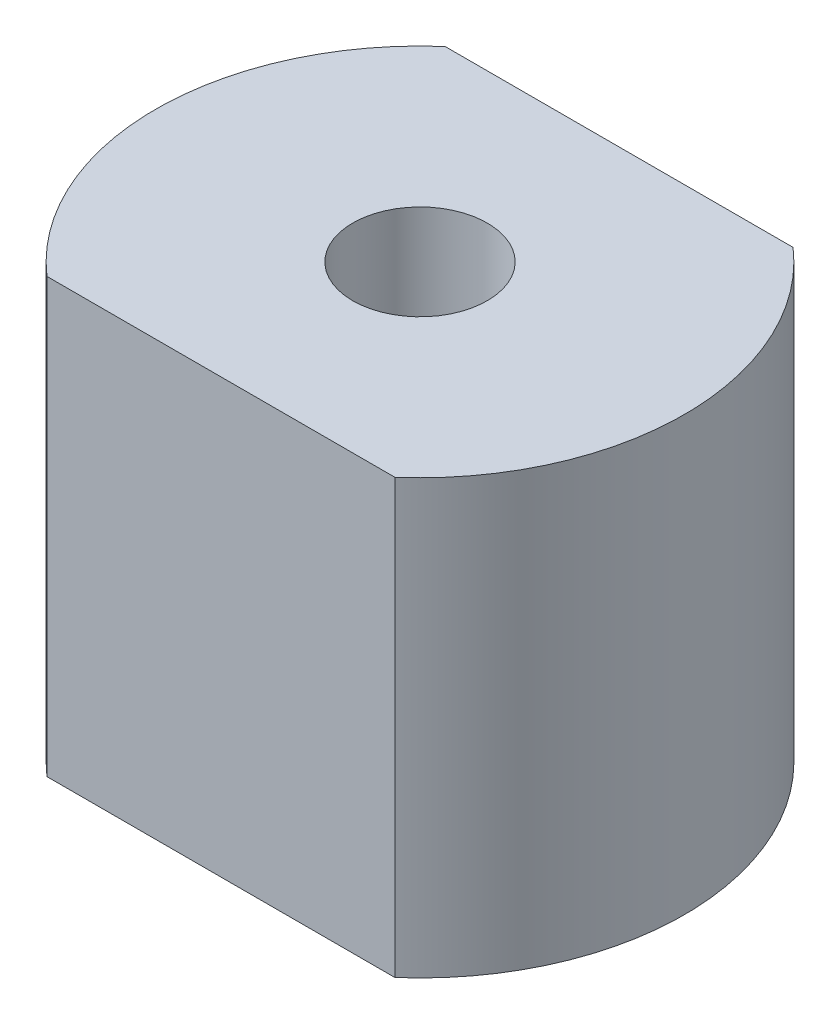
ISO-10303-21;
HEADER;
FILE_DESCRIPTION(('STEP AP214'),'2;1');
FILE_NAME('part.step','',(''),(''),'','','');
FILE_SCHEMA(('AUTOMOTIVE_DESIGN { 1 0 10303 214 1 1 1 1 }'));
ENDSEC;
DATA;
#1=APPLICATION_CONTEXT('core data for automotive mechanical design processes');
#2=APPLICATION_PROTOCOL_DEFINITION('international standard','automotive_design',2000,#1);
#3=PRODUCT_CONTEXT('',#1,'mechanical');
#4=PRODUCT('Part','Part','',(#3));
#5=PRODUCT_RELATED_PRODUCT_CATEGORY('part','',(#4));
#6=PRODUCT_DEFINITION_FORMATION('','',#4);
#7=PRODUCT_DEFINITION_CONTEXT('part definition',#1,'design');
#8=PRODUCT_DEFINITION('design','',#6,#7);
#9=PRODUCT_DEFINITION_SHAPE('','',#8);
#10=(LENGTH_UNIT() NAMED_UNIT(*) SI_UNIT(.MILLI.,.METRE.));
#11=(NAMED_UNIT(*) PLANE_ANGLE_UNIT() SI_UNIT($,.RADIAN.));
#12=(NAMED_UNIT(*) SI_UNIT($,.STERADIAN.) SOLID_ANGLE_UNIT());
#13=UNCERTAINTY_MEASURE_WITH_UNIT(LENGTH_MEASURE(1.E-05),#10,'distance_accuracy_value','');
#14=(GEOMETRIC_REPRESENTATION_CONTEXT(3) GLOBAL_UNCERTAINTY_ASSIGNED_CONTEXT((#13)) GLOBAL_UNIT_ASSIGNED_CONTEXT((#10,
#11,#12)) REPRESENTATION_CONTEXT('',''));
#15=CARTESIAN_POINT('',(0.,0.,0.));
#16=DIRECTION('',(0.,0.,1.));
#17=DIRECTION('',(1.,0.,0.));
#18=AXIS2_PLACEMENT_3D('',#15,#16,#17);
#19=CARTESIAN_POINT('',(2.57570117955439,0.,8.09122870249017));
#20=DIRECTION('',(0.,-1.,0.));
#21=DIRECTION('',(0.,0.,-1.));
#22=AXIS2_PLACEMENT_3D('',#19,#20,#21);
#23=CYLINDRICAL_SURFACE('',#22,5.207);
#24=CARTESIAN_POINT('',(2.57570117955439,8.128,8.09122870249017));
#25=DIRECTION('',(0.,-1.,0.));
#26=DIRECTION('',(0.,0.,-1.));
#27=AXIS2_PLACEMENT_3D('',#24,#25,#26);
#28=CIRCLE('',#27,5.207);
#29=CARTESIAN_POINT('',(2.57570117955439,8.128,2.88422870249017));
#30=VERTEX_POINT('',#29);
#31=EDGE_CURVE('E112',#30,#30,#28,.F.);
#32=ORIENTED_EDGE('',*,*,#31,.T.);
#33=EDGE_LOOP('',(#32));
#34=FACE_BOUND('',#33,.T.);
#35=CARTESIAN_POINT('',(2.57570117955439,4.064,8.09122870249017));
#36=DIRECTION('',(0.,-1.,0.));
#37=DIRECTION('',(0.,0.,-1.));
#38=AXIS2_PLACEMENT_3D('',#35,#36,#37);
#39=CIRCLE('',#38,5.207);
#40=CARTESIAN_POINT('',(2.57570117955439,4.064,2.88422870249017));
#41=VERTEX_POINT('',#40);
#42=EDGE_CURVE('E19',#41,#41,#39,.T.);
#43=ORIENTED_EDGE('',*,*,#42,.T.);
#44=EDGE_LOOP('',(#43));
#45=FACE_BOUND('',#44,.T.);
#46=ADVANCED_FACE('F16',(#34,#45),#23,.F.);
#47=CARTESIAN_POINT('',(10.7037011795544,12.7,8.09122870249017));
#48=DIRECTION('',(0.,1.,0.));
#49=DIRECTION('',(0.,0.,1.));
#50=AXIS2_PLACEMENT_3D('',#47,#48,#49);
#51=PLANE('',#50);
#52=CARTESIAN_POINT('',(10.7037011795544,12.7,8.09122870249017));
#53=DIRECTION('',(0.,-1.,0.));
#54=DIRECTION('',(0.,0.,-1.));
#55=AXIS2_PLACEMENT_3D('',#52,#53,#54);
#56=CIRCLE('',#55,1.07823);
#57=CARTESIAN_POINT('',(10.7037011795544,12.7,7.01299870249017));
#58=VERTEX_POINT('',#57);
#59=EDGE_CURVE('E110',#58,#58,#56,.T.);
#60=ORIENTED_EDGE('',*,*,#59,.T.);
#61=EDGE_LOOP('',(#60));
#62=FACE_BOUND('',#61,.T.);
#63=ADVANCED_FACE('F247',(#62),#51,.F.);
#64=CARTESIAN_POINT('',(-5.55229882044561,12.7,8.09122870249017));
#65=DIRECTION('',(0.,1.,0.));
#66=DIRECTION('',(0.,0.,1.));
#67=AXIS2_PLACEMENT_3D('',#64,#65,#66);
#68=PLANE('',#67);
#69=CARTESIAN_POINT('',(-5.55229882044561,12.7,8.09122870249017));
#70=DIRECTION('',(0.,-1.,0.));
#71=DIRECTION('',(0.,0.,-1.));
#72=AXIS2_PLACEMENT_3D('',#69,#70,#71);
#73=CIRCLE('',#72,1.07823);
#74=CARTESIAN_POINT('',(-5.55229882044561,12.7,7.01299870249017));
#75=VERTEX_POINT('',#74);
#76=EDGE_CURVE('E107',#75,#75,#73,.T.);
#77=ORIENTED_EDGE('',*,*,#76,.T.);
#78=EDGE_LOOP('',(#77));
#79=FACE_BOUND('',#78,.T.);
#80=ADVANCED_FACE('F124',(#79),#68,.F.);
#81=CARTESIAN_POINT('',(2.57570117955439,4.064,8.09122870249017));
#82=DIRECTION('',(0.,1.,0.));
#83=DIRECTION('',(0.,0.,1.));
#84=AXIS2_PLACEMENT_3D('',#81,#82,#83);
#85=PLANE('',#84);
#86=ORIENTED_EDGE('',*,*,#42,.F.);
#87=EDGE_LOOP('',(#86));
#88=FACE_BOUND('',#87,.T.);
#89=CARTESIAN_POINT('',(2.57570117955439,4.064,8.09122870249017));
#90=DIRECTION('',(0.,1.,0.));
#91=DIRECTION('',(0.,0.,1.));
#92=AXIS2_PLACEMENT_3D('',#89,#90,#91);
#93=CIRCLE('',#92,6.3754);
#94=CARTESIAN_POINT('',(2.57570117955439,4.064,14.4666287024902));
#95=VERTEX_POINT('',#94);
#96=EDGE_CURVE('E104',#95,#95,#93,.F.);
#97=ORIENTED_EDGE('',*,*,#96,.T.);
#98=EDGE_LOOP('',(#97));
#99=FACE_BOUND('',#98,.T.);
#100=ADVANCED_FACE('F120',(#88,#99),#85,.F.);
#101=CARTESIAN_POINT('',(2.57570117955439,8.128,8.09122870249017));
#102=DIRECTION('',(0.,1.,0.));
#103=DIRECTION('',(0.,0.,1.));
#104=AXIS2_PLACEMENT_3D('',#101,#102,#103);
#105=PLANE('',#104);
#106=ORIENTED_EDGE('',*,*,#31,.F.);
#107=EDGE_LOOP('',(#106));
#108=FACE_BOUND('',#107,.T.);
#109=CARTESIAN_POINT('',(2.57570117955439,8.128,8.09122870249017));
#110=DIRECTION('',(0.,1.,0.));
#111=DIRECTION('',(0.,0.,1.));
#112=AXIS2_PLACEMENT_3D('',#109,#110,#111);
#113=CIRCLE('',#112,2.68351);
#114=CARTESIAN_POINT('',(2.57570117955439,8.128,10.7747387024902));
#115=VERTEX_POINT('',#114);
#116=EDGE_CURVE('E74',#115,#115,#113,.T.);
#117=ORIENTED_EDGE('',*,*,#116,.T.);
#118=EDGE_LOOP('',(#117));
#119=FACE_BOUND('',#118,.T.);
#120=ADVANCED_FACE('F123',(#108,#119),#105,.F.);
#121=CARTESIAN_POINT('',(10.7037011795544,0.,8.09122870249017));
#122=DIRECTION('',(0.,-1.,0.));
#123=DIRECTION('',(0.,0.,-1.));
#124=AXIS2_PLACEMENT_3D('',#121,#122,#123);
#125=CYLINDRICAL_SURFACE('',#124,1.07823);
#126=CARTESIAN_POINT('',(10.7037011795544,0.,8.09122870249017));
#127=DIRECTION('',(0.,-1.,0.));
#128=DIRECTION('',(0.,0.,-1.));
#129=AXIS2_PLACEMENT_3D('',#126,#127,#128);
#130=CIRCLE('',#129,1.07823);
#131=CARTESIAN_POINT('',(10.7037011795544,0.,7.01299870249017));
#132=VERTEX_POINT('',#131);
#133=EDGE_CURVE('E73',#132,#132,#130,.T.);
#134=ORIENTED_EDGE('',*,*,#133,.T.);
#135=EDGE_LOOP('',(#134));
#136=FACE_BOUND('',#135,.T.);
#137=ORIENTED_EDGE('',*,*,#59,.F.);
#138=EDGE_LOOP('',(#137));
#139=FACE_BOUND('',#138,.T.);
#140=ADVANCED_FACE('F141',(#136,#139),#125,.F.);
#141=CARTESIAN_POINT('',(-5.55229882044561,0.,8.09122870249017));
#142=DIRECTION('',(0.,-1.,0.));
#143=DIRECTION('',(0.,0.,-1.));
#144=AXIS2_PLACEMENT_3D('',#141,#142,#143);
#145=CYLINDRICAL_SURFACE('',#144,1.07823);
#146=CARTESIAN_POINT('',(-5.55229882044561,0.,8.09122870249017));
#147=DIRECTION('',(0.,-1.,0.));
#148=DIRECTION('',(0.,0.,-1.));
#149=AXIS2_PLACEMENT_3D('',#146,#147,#148);
#150=CIRCLE('',#149,1.07823);
#151=CARTESIAN_POINT('',(-5.55229882044561,0.,7.01299870249017));
#152=VERTEX_POINT('',#151);
#153=EDGE_CURVE('E97',#152,#152,#150,.T.);
#154=ORIENTED_EDGE('',*,*,#153,.T.);
#155=EDGE_LOOP('',(#154));
#156=FACE_BOUND('',#155,.T.);
#157=ORIENTED_EDGE('',*,*,#76,.F.);
#158=EDGE_LOOP('',(#157));
#159=FACE_BOUND('',#158,.T.);
#160=ADVANCED_FACE('F131',(#156,#159),#145,.F.);
#161=CARTESIAN_POINT('',(2.57570117955439,4.064,8.09122870249017));
#162=DIRECTION('',(0.,1.,0.));
#163=DIRECTION('',(0.,0.,1.));
#164=AXIS2_PLACEMENT_3D('',#161,#162,#163);
#165=CYLINDRICAL_SURFACE('',#164,6.3754);
#166=CARTESIAN_POINT('',(2.57570117955439,0.,8.09122870249017));
#167=DIRECTION('',(0.,1.,0.));
#168=DIRECTION('',(0.,0.,1.));
#169=AXIS2_PLACEMENT_3D('',#166,#167,#168);
#170=CIRCLE('',#169,6.3754);
#171=CARTESIAN_POINT('',(2.57570117955439,0.,14.4666287024902));
#172=VERTEX_POINT('',#171);
#173=EDGE_CURVE('E65',#172,#172,#170,.F.);
#174=ORIENTED_EDGE('',*,*,#173,.T.);
#175=EDGE_LOOP('',(#174));
#176=FACE_BOUND('',#175,.T.);
#177=ORIENTED_EDGE('',*,*,#96,.F.);
#178=EDGE_LOOP('',(#177));
#179=FACE_BOUND('',#178,.T.);
#180=ADVANCED_FACE('F128',(#176,#179),#165,.F.);
#181=CARTESIAN_POINT('',(2.57570117955439,39.668265265213,8.09122870249017));
#182=DIRECTION('',(0.,1.,0.));
#183=DIRECTION('',(0.,0.,1.));
#184=AXIS2_PLACEMENT_3D('',#181,#182,#183);
#185=CYLINDRICAL_SURFACE('',#184,2.68351);
#186=CARTESIAN_POINT('',(2.57570117955439,17.272,8.09122870249017));
#187=DIRECTION('',(0.,1.,0.));
#188=DIRECTION('',(0.,0.,1.));
#189=AXIS2_PLACEMENT_3D('',#186,#187,#188);
#190=CIRCLE('',#189,2.68351);
#191=CARTESIAN_POINT('',(2.57570117955439,17.272,10.7747387024902));
#192=VERTEX_POINT('',#191);
#193=EDGE_CURVE('E80',#192,#192,#190,.F.);
#194=ORIENTED_EDGE('',*,*,#193,.F.);
#195=EDGE_LOOP('',(#194));
#196=FACE_BOUND('',#195,.T.);
#197=ORIENTED_EDGE('',*,*,#116,.F.);
#198=EDGE_LOOP('',(#197));
#199=FACE_BOUND('',#198,.T.);
#200=ADVANCED_FACE('F130',(#196,#199),#185,.F.);
#201=CARTESIAN_POINT('',(2.57570117955439,17.272,8.09122870249017));
#202=DIRECTION('',(0.,1.,0.));
#203=DIRECTION('',(0.,0.,1.));
#204=AXIS2_PLACEMENT_3D('',#201,#202,#203);
#205=CYLINDRICAL_SURFACE('',#204,10.541);
#206=CARTESIAN_POINT('',(2.57570117955439,17.272,8.09122870249017));
#207=DIRECTION('',(0.,1.,0.));
#208=DIRECTION('',(0.,0.,1.));
#209=AXIS2_PLACEMENT_3D('',#206,#207,#208);
#210=CIRCLE('',#209,10.541);
#211=CARTESIAN_POINT('',(-4.3603477497713,17.272,0.15372870249017));
#212=VERTEX_POINT('',#211);
#213=CARTESIAN_POINT('',(-4.36034774977128,17.272,16.0287287024902));
#214=VERTEX_POINT('',#213);
#215=EDGE_CURVE('E60',#212,#214,#210,.T.);
#216=ORIENTED_EDGE('',*,*,#215,.F.);
#217=DIRECTION('',(0.,1.,0.));
#218=VECTOR('',#217,1.);
#219=CARTESIAN_POINT('',(-4.3603477497713,17.272,0.153728702490171));
#220=LINE('',#219,#218);
#221=CARTESIAN_POINT('',(-4.3603477497713,0.,0.153728702490171));
#222=VERTEX_POINT('',#221);
#223=EDGE_CURVE('E55',#212,#222,#220,.F.);
#224=ORIENTED_EDGE('',*,*,#223,.T.);
#225=CARTESIAN_POINT('',(2.57570117955439,0.,8.09122870249017));
#226=DIRECTION('',(0.,1.,0.));
#227=DIRECTION('',(0.,0.,1.));
#228=AXIS2_PLACEMENT_3D('',#225,#226,#227);
#229=CIRCLE('',#228,10.541);
#230=CARTESIAN_POINT('',(-4.36034774977128,0.,16.0287287024902));
#231=VERTEX_POINT('',#230);
#232=EDGE_CURVE('E58',#222,#231,#229,.T.);
#233=ORIENTED_EDGE('',*,*,#232,.T.);
#234=DIRECTION('',(0.,1.,0.));
#235=VECTOR('',#234,1.);
#236=CARTESIAN_POINT('',(-4.36034774977129,17.272,16.0287287024902));
#237=LINE('',#236,#235);
#238=EDGE_CURVE('E88',#231,#214,#237,.T.);
#239=ORIENTED_EDGE('',*,*,#238,.T.);
#240=EDGE_LOOP('',(#216,#224,#233,#239));
#241=FACE_BOUND('',#240,.T.);
#242=ADVANCED_FACE('F57',(#241),#205,.T.);
#243=CARTESIAN_POINT('',(2.57570117955439,0.,8.09122870249017));
#244=DIRECTION('',(0.,1.,0.));
#245=DIRECTION('',(0.,0.,1.));
#246=AXIS2_PLACEMENT_3D('',#243,#244,#245);
#247=PLANE('',#246);
#248=ORIENTED_EDGE('',*,*,#173,.F.);
#249=EDGE_LOOP('',(#248));
#250=FACE_BOUND('',#249,.T.);
#251=ORIENTED_EDGE('',*,*,#153,.F.);
#252=EDGE_LOOP('',(#251));
#253=FACE_BOUND('',#252,.T.);
#254=ORIENTED_EDGE('',*,*,#133,.F.);
#255=EDGE_LOOP('',(#254));
#256=FACE_BOUND('',#255,.T.);
#257=DIRECTION('',(1.,0.,0.));
#258=VECTOR('',#257,1.);
#259=CARTESIAN_POINT('',(9.51175010888007,0.,0.153728702490171));
#260=LINE('',#259,#258);
#261=CARTESIAN_POINT('',(9.51175010888007,0.,0.153728702490169));
#262=VERTEX_POINT('',#261);
#263=EDGE_CURVE('E64',#222,#262,#260,.T.);
#264=ORIENTED_EDGE('',*,*,#263,.T.);
#265=CARTESIAN_POINT('',(2.57570117955439,0.,8.09122870249017));
#266=DIRECTION('',(0.,1.,0.));
#267=DIRECTION('',(0.,0.,1.));
#268=AXIS2_PLACEMENT_3D('',#265,#266,#267);
#269=CIRCLE('',#268,10.541);
#270=CARTESIAN_POINT('',(9.51175010888005,0.,16.0287287024902));
#271=VERTEX_POINT('',#270);
#272=EDGE_CURVE('E87',#271,#262,#269,.T.);
#273=ORIENTED_EDGE('',*,*,#272,.F.);
#274=DIRECTION('',(-1.,0.,0.));
#275=VECTOR('',#274,1.);
#276=CARTESIAN_POINT('',(-4.36034774977129,0.,16.0287287024902));
#277=LINE('',#276,#275);
#278=EDGE_CURVE('E71',#271,#231,#277,.T.);
#279=ORIENTED_EDGE('',*,*,#278,.T.);
#280=ORIENTED_EDGE('',*,*,#232,.F.);
#281=EDGE_LOOP('',(#264,#273,#279,#280));
#282=FACE_BOUND('',#281,.T.);
#283=ADVANCED_FACE('F68',(#250,#253,#256,#282),#247,.F.);
#284=CARTESIAN_POINT('',(9.51175010888007,17.272,0.153728702490171));
#285=DIRECTION('',(0.,0.,1.));
#286=DIRECTION('',(1.,0.,0.));
#287=AXIS2_PLACEMENT_3D('',#284,#285,#286);
#288=PLANE('',#287);
#289=ORIENTED_EDGE('',*,*,#223,.F.);
#290=DIRECTION('',(1.,0.,0.));
#291=VECTOR('',#290,1.);
#292=CARTESIAN_POINT('',(2.57570117955439,17.272,0.153728702490169));
#293=LINE('',#292,#291);
#294=CARTESIAN_POINT('',(9.51175010888007,17.272,0.153728702490168));
#295=VERTEX_POINT('',#294);
#296=EDGE_CURVE('E89',#295,#212,#293,.F.);
#297=ORIENTED_EDGE('',*,*,#296,.F.);
#298=DIRECTION('',(0.,1.,0.));
#299=VECTOR('',#298,1.);
#300=CARTESIAN_POINT('',(9.51175010888007,17.272,0.153728702490167));
#301=LINE('',#300,#299);
#302=EDGE_CURVE('E78',#262,#295,#301,.T.);
#303=ORIENTED_EDGE('',*,*,#302,.F.);
#304=ORIENTED_EDGE('',*,*,#263,.F.);
#305=EDGE_LOOP('',(#289,#297,#303,#304));
#306=FACE_BOUND('',#305,.T.);
#307=ADVANCED_FACE('F76',(#306),#288,.F.);
#308=CARTESIAN_POINT('',(2.57570117955439,17.272,8.09122870249017));
#309=DIRECTION('',(0.,1.,0.));
#310=DIRECTION('',(0.,0.,1.));
#311=AXIS2_PLACEMENT_3D('',#308,#309,#310);
#312=PLANE('',#311);
#313=CARTESIAN_POINT('',(2.57570117955439,17.272,8.09122870249017));
#314=DIRECTION('',(0.,1.,0.));
#315=DIRECTION('',(0.,0.,1.));
#316=AXIS2_PLACEMENT_3D('',#313,#314,#315);
#317=CIRCLE('',#316,10.541);
#318=CARTESIAN_POINT('',(9.51175010888005,17.272,16.0287287024902));
#319=VERTEX_POINT('',#318);
#320=EDGE_CURVE('E25',#295,#319,#317,.F.);
#321=ORIENTED_EDGE('',*,*,#320,.F.);
#322=ORIENTED_EDGE('',*,*,#296,.T.);
#323=ORIENTED_EDGE('',*,*,#215,.T.);
#324=DIRECTION('',(-1.,0.,0.));
#325=VECTOR('',#324,1.);
#326=CARTESIAN_POINT('',(-4.36034774977129,17.272,16.0287287024902));
#327=LINE('',#326,#325);
#328=EDGE_CURVE('E34',#214,#319,#327,.F.);
#329=ORIENTED_EDGE('',*,*,#328,.T.);
#330=EDGE_LOOP('',(#321,#322,#323,#329));
#331=FACE_BOUND('',#330,.T.);
#332=ORIENTED_EDGE('',*,*,#193,.T.);
#333=EDGE_LOOP('',(#332));
#334=FACE_BOUND('',#333,.T.);
#335=ADVANCED_FACE('F152',(#331,#334),#312,.T.);
#336=CARTESIAN_POINT('',(-4.36034774977129,17.272,16.0287287024902));
#337=DIRECTION('',(0.,0.,-1.));
#338=DIRECTION('',(-1.,0.,0.));
#339=AXIS2_PLACEMENT_3D('',#336,#337,#338);
#340=PLANE('',#339);
#341=DIRECTION('',(0.,1.,0.));
#342=VECTOR('',#341,1.);
#343=CARTESIAN_POINT('',(9.51175010888006,17.272,16.0287287024902));
#344=LINE('',#343,#342);
#345=EDGE_CURVE('E11',#319,#271,#344,.F.);
#346=ORIENTED_EDGE('',*,*,#345,.F.);
#347=ORIENTED_EDGE('',*,*,#328,.F.);
#348=ORIENTED_EDGE('',*,*,#238,.F.);
#349=ORIENTED_EDGE('',*,*,#278,.F.);
#350=EDGE_LOOP('',(#346,#347,#348,#349));
#351=FACE_BOUND('',#350,.T.);
#352=ADVANCED_FACE('F146',(#351),#340,.F.);
#353=CARTESIAN_POINT('',(2.57570117955439,17.272,8.09122870249017));
#354=DIRECTION('',(0.,1.,0.));
#355=DIRECTION('',(0.,0.,1.));
#356=AXIS2_PLACEMENT_3D('',#353,#354,#355);
#357=CYLINDRICAL_SURFACE('',#356,10.541);
#358=ORIENTED_EDGE('',*,*,#320,.T.);
#359=ORIENTED_EDGE('',*,*,#345,.T.);
#360=ORIENTED_EDGE('',*,*,#272,.T.);
#361=ORIENTED_EDGE('',*,*,#302,.T.);
#362=EDGE_LOOP('',(#358,#359,#360,#361));
#363=FACE_BOUND('',#362,.T.);
#364=ADVANCED_FACE('F144',(#363),#357,.T.);
#365=CLOSED_SHELL('',(#46,#63,#80,#100,#120,#140,#160,#180,#200,#242,#283,#307,#335,#352,#364));
#366=MANIFOLD_SOLID_BREP('B1',#365);
#367=ADVANCED_BREP_SHAPE_REPRESENTATION('',(#18,#366),#14);
#368=SHAPE_DEFINITION_REPRESENTATION(#9,#367);
ENDSEC;
END-ISO-10303-21;
